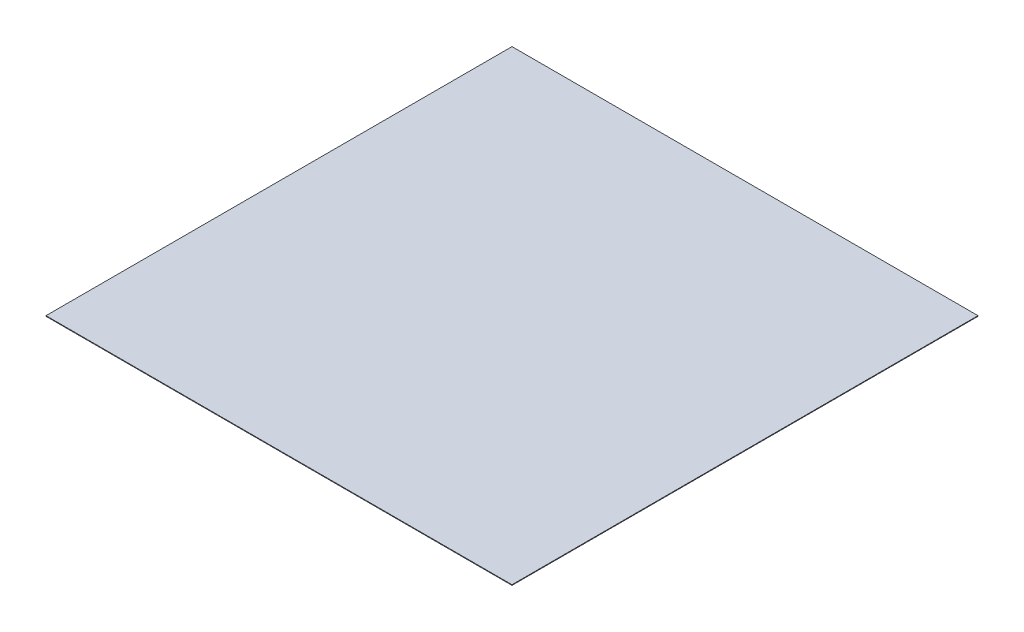
ISO-10303-21;
HEADER;
FILE_DESCRIPTION(('STEP AP214'),'2;1');
FILE_NAME('part.step','',(''),(''),'','','');
FILE_SCHEMA(('AUTOMOTIVE_DESIGN { 1 0 10303 214 1 1 1 1 }'));
ENDSEC;
DATA;
#1=APPLICATION_CONTEXT('core data for automotive mechanical design processes');
#2=APPLICATION_PROTOCOL_DEFINITION('international standard','automotive_design',2000,#1);
#3=PRODUCT_CONTEXT('',#1,'mechanical');
#4=PRODUCT('Part','Part','',(#3));
#5=PRODUCT_RELATED_PRODUCT_CATEGORY('part','',(#4));
#6=PRODUCT_DEFINITION_FORMATION('','',#4);
#7=PRODUCT_DEFINITION_CONTEXT('part definition',#1,'design');
#8=PRODUCT_DEFINITION('design','',#6,#7);
#9=PRODUCT_DEFINITION_SHAPE('','',#8);
#10=(LENGTH_UNIT() NAMED_UNIT(*) SI_UNIT(.MILLI.,.METRE.));
#11=(NAMED_UNIT(*) PLANE_ANGLE_UNIT() SI_UNIT($,.RADIAN.));
#12=(NAMED_UNIT(*) SI_UNIT($,.STERADIAN.) SOLID_ANGLE_UNIT());
#13=UNCERTAINTY_MEASURE_WITH_UNIT(LENGTH_MEASURE(1.E-05),#10,'distance_accuracy_value','');
#14=(GEOMETRIC_REPRESENTATION_CONTEXT(3) GLOBAL_UNCERTAINTY_ASSIGNED_CONTEXT((#13)) GLOBAL_UNIT_ASSIGNED_CONTEXT((#10,
#11,#12)) REPRESENTATION_CONTEXT('',''));
#15=CARTESIAN_POINT('',(0.,0.,0.));
#16=DIRECTION('',(0.,0.,1.));
#17=DIRECTION('',(1.,0.,0.));
#18=AXIS2_PLACEMENT_3D('',#15,#16,#17);
#19=CARTESIAN_POINT('',(-457.2,0.5969,457.2));
#20=DIRECTION('',(1.,0.,0.));
#21=DIRECTION('',(0.,0.,-1.));
#22=AXIS2_PLACEMENT_3D('',#19,#20,#21);
#23=PLANE('',#22);
#24=DIRECTION('',(0.,0.,-1.));
#25=VECTOR('',#24,1.);
#26=CARTESIAN_POINT('',(-457.2,0.5969,457.2));
#27=LINE('',#26,#25);
#28=CARTESIAN_POINT('',(-457.2,0.5969,457.2));
#29=VERTEX_POINT('',#28);
#30=CARTESIAN_POINT('',(-457.2,0.5969,-457.2));
#31=VERTEX_POINT('',#30);
#32=EDGE_CURVE('E91',#29,#31,#27,.T.);
#33=ORIENTED_EDGE('',*,*,#32,.T.);
#34=DIRECTION('',(0.,-1.,0.));
#35=VECTOR('',#34,1.);
#36=CARTESIAN_POINT('',(-457.2,0.5969,-457.2));
#37=LINE('',#36,#35);
#38=CARTESIAN_POINT('',(-457.2,-0.5969,-457.2));
#39=VERTEX_POINT('',#38);
#40=EDGE_CURVE('E86',#31,#39,#37,.T.);
#41=ORIENTED_EDGE('',*,*,#40,.T.);
#42=DIRECTION('',(0.,0.,-1.));
#43=VECTOR('',#42,1.);
#44=CARTESIAN_POINT('',(-457.2,-0.5969,457.2));
#45=LINE('',#44,#43);
#46=CARTESIAN_POINT('',(-457.2,-0.5969,457.2));
#47=VERTEX_POINT('',#46);
#48=EDGE_CURVE('E11',#47,#39,#45,.T.);
#49=ORIENTED_EDGE('',*,*,#48,.F.);
#50=DIRECTION('',(0.,-1.,0.));
#51=VECTOR('',#50,1.);
#52=CARTESIAN_POINT('',(-457.2,0.5969,457.2));
#53=LINE('',#52,#51);
#54=EDGE_CURVE('E97',#29,#47,#53,.T.);
#55=ORIENTED_EDGE('',*,*,#54,.F.);
#56=EDGE_LOOP('',(#33,#41,#49,#55));
#57=FACE_BOUND('',#56,.T.);
#58=ADVANCED_FACE('F34',(#57),#23,.F.);
#59=CARTESIAN_POINT('',(457.2,-0.5969,457.2));
#60=DIRECTION('',(0.,1.,0.));
#61=DIRECTION('',(0.,0.,1.));
#62=AXIS2_PLACEMENT_3D('',#59,#60,#61);
#63=PLANE('',#62);
#64=ORIENTED_EDGE('',*,*,#48,.T.);
#65=DIRECTION('',(1.,0.,0.));
#66=VECTOR('',#65,1.);
#67=CARTESIAN_POINT('',(457.2,-0.5969,-457.2));
#68=LINE('',#67,#66);
#69=CARTESIAN_POINT('',(457.2,-0.5969,-457.2));
#70=VERTEX_POINT('',#69);
#71=EDGE_CURVE('E76',#39,#70,#68,.T.);
#72=ORIENTED_EDGE('',*,*,#71,.T.);
#73=DIRECTION('',(0.,0.,-1.));
#74=VECTOR('',#73,1.);
#75=CARTESIAN_POINT('',(457.2,-0.5969,457.2));
#76=LINE('',#75,#74);
#77=CARTESIAN_POINT('',(457.2,-0.5969,457.2));
#78=VERTEX_POINT('',#77);
#79=EDGE_CURVE('E41',#78,#70,#76,.T.);
#80=ORIENTED_EDGE('',*,*,#79,.F.);
#81=DIRECTION('',(1.,0.,0.));
#82=VECTOR('',#81,1.);
#83=CARTESIAN_POINT('',(457.2,-0.5969,457.2));
#84=LINE('',#83,#82);
#85=EDGE_CURVE('E77',#47,#78,#84,.T.);
#86=ORIENTED_EDGE('',*,*,#85,.F.);
#87=EDGE_LOOP('',(#64,#72,#80,#86));
#88=FACE_BOUND('',#87,.T.);
#89=ADVANCED_FACE('F74',(#88),#63,.F.);
#90=CARTESIAN_POINT('',(457.2,0.5969,457.2));
#91=DIRECTION('',(-1.,0.,0.));
#92=DIRECTION('',(0.,0.,1.));
#93=AXIS2_PLACEMENT_3D('',#90,#91,#92);
#94=PLANE('',#93);
#95=ORIENTED_EDGE('',*,*,#79,.T.);
#96=DIRECTION('',(0.,1.,0.));
#97=VECTOR('',#96,1.);
#98=CARTESIAN_POINT('',(457.2,0.5969,-457.2));
#99=LINE('',#98,#97);
#100=CARTESIAN_POINT('',(457.2,0.5969,-457.2));
#101=VERTEX_POINT('',#100);
#102=EDGE_CURVE('E89',#70,#101,#99,.T.);
#103=ORIENTED_EDGE('',*,*,#102,.T.);
#104=DIRECTION('',(0.,0.,-1.));
#105=VECTOR('',#104,1.);
#106=CARTESIAN_POINT('',(457.2,0.5969,457.2));
#107=LINE('',#106,#105);
#108=CARTESIAN_POINT('',(457.2,0.5969,457.2));
#109=VERTEX_POINT('',#108);
#110=EDGE_CURVE('E103',#109,#101,#107,.T.);
#111=ORIENTED_EDGE('',*,*,#110,.F.);
#112=DIRECTION('',(0.,1.,0.));
#113=VECTOR('',#112,1.);
#114=CARTESIAN_POINT('',(457.2,0.5969,457.2));
#115=LINE('',#114,#113);
#116=EDGE_CURVE('E53',#78,#109,#115,.T.);
#117=ORIENTED_EDGE('',*,*,#116,.F.);
#118=EDGE_LOOP('',(#95,#103,#111,#117));
#119=FACE_BOUND('',#118,.T.);
#120=ADVANCED_FACE('F105',(#119),#94,.F.);
#121=CARTESIAN_POINT('',(457.2,0.5969,457.2));
#122=DIRECTION('',(0.,-1.,0.));
#123=DIRECTION('',(0.,0.,-1.));
#124=AXIS2_PLACEMENT_3D('',#121,#122,#123);
#125=PLANE('',#124);
#126=ORIENTED_EDGE('',*,*,#110,.T.);
#127=DIRECTION('',(-1.,0.,0.));
#128=VECTOR('',#127,1.);
#129=CARTESIAN_POINT('',(457.2,0.5969,-457.2));
#130=LINE('',#129,#128);
#131=EDGE_CURVE('E95',#101,#31,#130,.T.);
#132=ORIENTED_EDGE('',*,*,#131,.T.);
#133=ORIENTED_EDGE('',*,*,#32,.F.);
#134=DIRECTION('',(-1.,0.,0.));
#135=VECTOR('',#134,1.);
#136=CARTESIAN_POINT('',(457.2,0.5969,457.2));
#137=LINE('',#136,#135);
#138=EDGE_CURVE('E48',#109,#29,#137,.T.);
#139=ORIENTED_EDGE('',*,*,#138,.F.);
#140=EDGE_LOOP('',(#126,#132,#133,#139));
#141=FACE_BOUND('',#140,.T.);
#142=ADVANCED_FACE('F107',(#141),#125,.F.);
#143=CARTESIAN_POINT('',(0.,0.,457.2));
#144=DIRECTION('',(0.,0.,-1.));
#145=DIRECTION('',(-1.,0.,0.));
#146=AXIS2_PLACEMENT_3D('',#143,#144,#145);
#147=PLANE('',#146);
#148=ORIENTED_EDGE('',*,*,#54,.T.);
#149=ORIENTED_EDGE('',*,*,#85,.T.);
#150=ORIENTED_EDGE('',*,*,#116,.T.);
#151=ORIENTED_EDGE('',*,*,#138,.T.);
#152=EDGE_LOOP('',(#148,#149,#150,#151));
#153=FACE_BOUND('',#152,.T.);
#154=ADVANCED_FACE('F108',(#153),#147,.F.);
#155=CARTESIAN_POINT('',(0.,0.,-457.2));
#156=DIRECTION('',(0.,0.,-1.));
#157=DIRECTION('',(-1.,0.,0.));
#158=AXIS2_PLACEMENT_3D('',#155,#156,#157);
#159=PLANE('',#158);
#160=ORIENTED_EDGE('',*,*,#40,.F.);
#161=ORIENTED_EDGE('',*,*,#131,.F.);
#162=ORIENTED_EDGE('',*,*,#102,.F.);
#163=ORIENTED_EDGE('',*,*,#71,.F.);
#164=EDGE_LOOP('',(#160,#161,#162,#163));
#165=FACE_BOUND('',#164,.T.);
#166=ADVANCED_FACE('F84',(#165),#159,.T.);
#167=CLOSED_SHELL('',(#58,#89,#120,#142,#154,#166));
#168=MANIFOLD_SOLID_BREP('B2',#167);
#169=ADVANCED_BREP_SHAPE_REPRESENTATION('',(#18,#168),#14);
#170=SHAPE_DEFINITION_REPRESENTATION(#9,#169);
ENDSEC;
END-ISO-10303-21;
